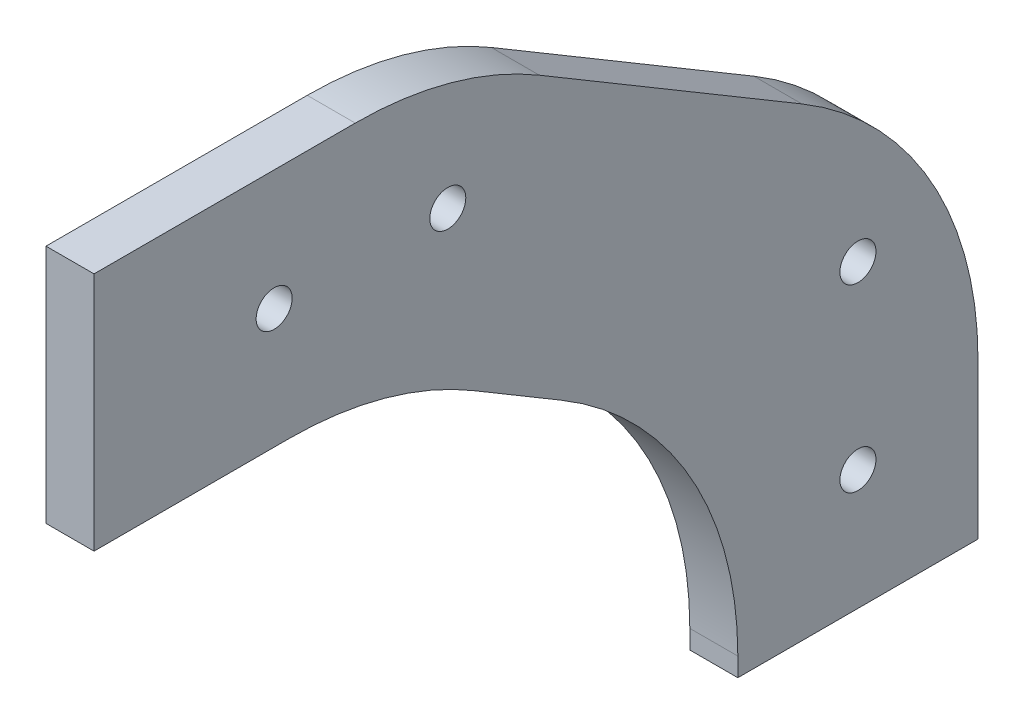
ISO-10303-21;
HEADER;
FILE_DESCRIPTION(('STEP AP214'),'2;1');
FILE_NAME('part.step','',(''),(''),'','','');
FILE_SCHEMA(('AUTOMOTIVE_DESIGN { 1 0 10303 214 1 1 1 1 }'));
ENDSEC;
DATA;
#1=APPLICATION_CONTEXT('core data for automotive mechanical design processes');
#2=APPLICATION_PROTOCOL_DEFINITION('international standard','automotive_design',2000,#1);
#3=PRODUCT_CONTEXT('',#1,'mechanical');
#4=PRODUCT('Part','Part','',(#3));
#5=PRODUCT_RELATED_PRODUCT_CATEGORY('part','',(#4));
#6=PRODUCT_DEFINITION_FORMATION('','',#4);
#7=PRODUCT_DEFINITION_CONTEXT('part definition',#1,'design');
#8=PRODUCT_DEFINITION('design','',#6,#7);
#9=PRODUCT_DEFINITION_SHAPE('','',#8);
#10=(LENGTH_UNIT() NAMED_UNIT(*) SI_UNIT(.MILLI.,.METRE.));
#11=(NAMED_UNIT(*) PLANE_ANGLE_UNIT() SI_UNIT($,.RADIAN.));
#12=(NAMED_UNIT(*) SI_UNIT($,.STERADIAN.) SOLID_ANGLE_UNIT());
#13=UNCERTAINTY_MEASURE_WITH_UNIT(LENGTH_MEASURE(1.E-05),#10,'distance_accuracy_value','');
#14=(GEOMETRIC_REPRESENTATION_CONTEXT(3) GLOBAL_UNCERTAINTY_ASSIGNED_CONTEXT((#13)) GLOBAL_UNIT_ASSIGNED_CONTEXT((#10,
#11,#12)) REPRESENTATION_CONTEXT('',''));
#15=CARTESIAN_POINT('',(0.,0.,0.));
#16=DIRECTION('',(0.,0.,1.));
#17=DIRECTION('',(1.,0.,0.));
#18=AXIS2_PLACEMENT_3D('',#15,#16,#17);
#19=CARTESIAN_POINT('',(4.,-27.3140015579769,-99.1176324259948));
#20=DIRECTION('',(0.,0.,-1.));
#21=DIRECTION('',(-1.,0.,0.));
#22=AXIS2_PLACEMENT_3D('',#19,#20,#21);
#23=PLANE('',#22);
#24=DIRECTION('',(0.,-1.,0.));
#25=VECTOR('',#24,1.);
#26=CARTESIAN_POINT('',(4.,-27.3140015579769,-99.1176324259948));
#27=LINE('',#26,#25);
#28=CARTESIAN_POINT('',(4.,-44.3776366971459,-99.1176324259948));
#29=VERTEX_POINT('',#28);
#30=CARTESIAN_POINT('',(4.,-45.938244798531,-99.1176324259948));
#31=VERTEX_POINT('',#30);
#32=EDGE_CURVE('E126',#29,#31,#27,.T.);
#33=ORIENTED_EDGE('',*,*,#32,.F.);
#34=DIRECTION('',(-1.,0.,0.));
#35=VECTOR('',#34,1.);
#36=CARTESIAN_POINT('',(0.,-44.3776366971459,-99.1176324259948));
#37=LINE('',#36,#35);
#38=CARTESIAN_POINT('',(0.,-44.3776366971459,-99.1176324259948));
#39=VERTEX_POINT('',#38);
#40=EDGE_CURVE('E153',#29,#39,#37,.T.);
#41=ORIENTED_EDGE('',*,*,#40,.T.);
#42=DIRECTION('',(0.,-1.,0.));
#43=VECTOR('',#42,1.);
#44=CARTESIAN_POINT('',(0.,-27.3140015579769,-99.1176324259948));
#45=LINE('',#44,#43);
#46=CARTESIAN_POINT('',(0.,-45.938244798531,-99.1176324259948));
#47=VERTEX_POINT('',#46);
#48=EDGE_CURVE('E151',#39,#47,#45,.T.);
#49=ORIENTED_EDGE('',*,*,#48,.T.);
#50=DIRECTION('',(-1.,0.,0.));
#51=VECTOR('',#50,1.);
#52=CARTESIAN_POINT('',(4.,-45.938244798531,-99.1176324259948));
#53=LINE('',#52,#51);
#54=EDGE_CURVE('E144',#31,#47,#53,.T.);
#55=ORIENTED_EDGE('',*,*,#54,.F.);
#56=EDGE_LOOP('',(#33,#41,#49,#55));
#57=FACE_BOUND('',#56,.T.);
#58=ADVANCED_FACE('F35',(#57),#23,.F.);
#59=CARTESIAN_POINT('',(4.,-45.938244798531,-119.117632425995));
#60=DIRECTION('',(0.,1.,0.));
#61=DIRECTION('',(0.,0.,1.));
#62=AXIS2_PLACEMENT_3D('',#59,#60,#61);
#63=PLANE('',#62);
#64=DIRECTION('',(0.,0.,-1.));
#65=VECTOR('',#64,1.);
#66=CARTESIAN_POINT('',(0.,-45.938244798531,-119.117632425995));
#67=LINE('',#66,#65);
#68=CARTESIAN_POINT('',(0.,-45.938244798531,-119.117632425995));
#69=VERTEX_POINT('',#68);
#70=EDGE_CURVE('E224',#47,#69,#67,.T.);
#71=ORIENTED_EDGE('',*,*,#70,.T.);
#72=DIRECTION('',(-1.,0.,0.));
#73=VECTOR('',#72,1.);
#74=CARTESIAN_POINT('',(4.,-45.938244798531,-119.117632425995));
#75=LINE('',#74,#73);
#76=CARTESIAN_POINT('',(4.,-45.938244798531,-119.117632425995));
#77=VERTEX_POINT('',#76);
#78=EDGE_CURVE('E146',#77,#69,#75,.T.);
#79=ORIENTED_EDGE('',*,*,#78,.F.);
#80=DIRECTION('',(0.,0.,-1.));
#81=VECTOR('',#80,1.);
#82=CARTESIAN_POINT('',(4.,-45.938244798531,-119.117632425995));
#83=LINE('',#82,#81);
#84=EDGE_CURVE('E130',#31,#77,#83,.T.);
#85=ORIENTED_EDGE('',*,*,#84,.F.);
#86=ORIENTED_EDGE('',*,*,#54,.T.);
#87=EDGE_LOOP('',(#71,#79,#85,#86));
#88=FACE_BOUND('',#87,.T.);
#89=ADVANCED_FACE('F143',(#88),#63,.F.);
#90=CARTESIAN_POINT('',(4.,-15.938244798531,-119.117632425995));
#91=DIRECTION('',(0.,0.,1.));
#92=DIRECTION('',(0.,-1.,0.));
#93=AXIS2_PLACEMENT_3D('',#90,#91,#92);
#94=PLANE('',#93);
#95=DIRECTION('',(0.,1.,0.));
#96=VECTOR('',#95,1.);
#97=CARTESIAN_POINT('',(0.,-15.938244798531,-119.117632425995));
#98=LINE('',#97,#96);
#99=CARTESIAN_POINT('',(0.,-33.0018799376999,-119.117632425995));
#100=VERTEX_POINT('',#99);
#101=EDGE_CURVE('E226',#69,#100,#98,.T.);
#102=ORIENTED_EDGE('',*,*,#101,.T.);
#103=DIRECTION('',(-1.,0.,0.));
#104=VECTOR('',#103,1.);
#105=CARTESIAN_POINT('',(4.,-33.0018799376999,-119.117632425995));
#106=LINE('',#105,#104);
#107=CARTESIAN_POINT('',(4.,-33.0018799376999,-119.117632425995));
#108=VERTEX_POINT('',#107);
#109=EDGE_CURVE('E174',#100,#108,#106,.F.);
#110=ORIENTED_EDGE('',*,*,#109,.T.);
#111=DIRECTION('',(0.,1.,0.));
#112=VECTOR('',#111,1.);
#113=CARTESIAN_POINT('',(4.,-15.938244798531,-119.117632425995));
#114=LINE('',#113,#112);
#115=EDGE_CURVE('E148',#77,#108,#114,.T.);
#116=ORIENTED_EDGE('',*,*,#115,.F.);
#117=ORIENTED_EDGE('',*,*,#78,.T.);
#118=EDGE_LOOP('',(#102,#110,#116,#117));
#119=FACE_BOUND('',#118,.T.);
#120=ADVANCED_FACE('F268',(#119),#94,.F.);
#121=CARTESIAN_POINT('',(4.,9.99999999999998,-75.499640594676));
#122=DIRECTION('',(0.,-0.85950799064041,0.511122308283726));
#123=DIRECTION('',(0.,-0.511122308283726,-0.85950799064041));
#124=AXIS2_PLACEMENT_3D('',#121,#122,#123);
#125=PLANE('',#124);
#126=DIRECTION('',(0.,0.511122308283726,0.85950799064041));
#127=VECTOR('',#126,1.);
#128=CARTESIAN_POINT('',(4.,9.99999999999998,-75.499640594676));
#129=LINE('',#128,#127);
#130=CARTESIAN_POINT('',(4.,-7.21664021848762,-104.451301674507));
#131=VERTEX_POINT('',#130);
#132=CARTESIAN_POINT('',(4.,5.78523971921229,-82.587220379904));
#133=VERTEX_POINT('',#132);
#134=EDGE_CURVE('E212',#131,#133,#129,.T.);
#135=ORIENTED_EDGE('',*,*,#134,.F.);
#136=DIRECTION('',(-1.,0.,0.));
#137=VECTOR('',#136,1.);
#138=CARTESIAN_POINT('',(4.,-7.21664021848762,-104.451301674507));
#139=LINE('',#138,#137);
#140=CARTESIAN_POINT('',(0.,-7.21664021848762,-104.451301674507));
#141=VERTEX_POINT('',#140);
#142=EDGE_CURVE('E167',#131,#141,#139,.T.);
#143=ORIENTED_EDGE('',*,*,#142,.T.);
#144=DIRECTION('',(0.,0.511122308283726,0.85950799064041));
#145=VECTOR('',#144,1.);
#146=CARTESIAN_POINT('',(0.,9.99999999999998,-75.499640594676));
#147=LINE('',#146,#145);
#148=CARTESIAN_POINT('',(0.,5.78523971921229,-82.587220379904));
#149=VERTEX_POINT('',#148);
#150=EDGE_CURVE('E229',#141,#149,#147,.T.);
#151=ORIENTED_EDGE('',*,*,#150,.T.);
#152=DIRECTION('',(-1.,0.,0.));
#153=VECTOR('',#152,1.);
#154=CARTESIAN_POINT('',(4.,5.78523971921229,-82.587220379904));
#155=LINE('',#154,#153);
#156=EDGE_CURVE('E165',#149,#133,#155,.F.);
#157=ORIENTED_EDGE('',*,*,#156,.T.);
#158=EDGE_LOOP('',(#135,#143,#151,#157));
#159=FACE_BOUND('',#158,.T.);
#160=ADVANCED_FACE('F276',(#159),#125,.F.);
#161=CARTESIAN_POINT('',(4.,9.99999999999998,-45.499640594676));
#162=DIRECTION('',(0.,-1.,0.));
#163=DIRECTION('',(0.,0.,-1.));
#164=AXIS2_PLACEMENT_3D('',#161,#162,#163);
#165=PLANE('',#164);
#166=DIRECTION('',(0.,0.,1.));
#167=VECTOR('',#166,1.);
#168=CARTESIAN_POINT('',(4.,9.99999999999998,-45.499640594676));
#169=LINE('',#168,#167);
#170=CARTESIAN_POINT('',(4.,9.99999999999998,-67.2535511313922));
#171=VERTEX_POINT('',#170);
#172=CARTESIAN_POINT('',(4.,9.99999999999998,-45.499640594676));
#173=VERTEX_POINT('',#172);
#174=EDGE_CURVE('E214',#171,#173,#169,.T.);
#175=ORIENTED_EDGE('',*,*,#174,.F.);
#176=DIRECTION('',(-1.,0.,0.));
#177=VECTOR('',#176,1.);
#178=CARTESIAN_POINT('',(4.,9.99999999999998,-67.2535511313922));
#179=LINE('',#178,#177);
#180=CARTESIAN_POINT('',(0.,9.99999999999998,-67.2535511313922));
#181=VERTEX_POINT('',#180);
#182=EDGE_CURVE('E180',#171,#181,#179,.T.);
#183=ORIENTED_EDGE('',*,*,#182,.T.);
#184=DIRECTION('',(0.,0.,1.));
#185=VECTOR('',#184,1.);
#186=CARTESIAN_POINT('',(0.,9.99999999999998,-45.499640594676));
#187=LINE('',#186,#185);
#188=CARTESIAN_POINT('',(0.,9.99999999999998,-45.499640594676));
#189=VERTEX_POINT('',#188);
#190=EDGE_CURVE('E232',#181,#189,#187,.T.);
#191=ORIENTED_EDGE('',*,*,#190,.T.);
#192=DIRECTION('',(-1.,0.,0.));
#193=VECTOR('',#192,1.);
#194=CARTESIAN_POINT('',(4.,9.99999999999998,-45.499640594676));
#195=LINE('',#194,#193);
#196=EDGE_CURVE('E157',#173,#189,#195,.T.);
#197=ORIENTED_EDGE('',*,*,#196,.F.);
#198=EDGE_LOOP('',(#175,#183,#191,#197));
#199=FACE_BOUND('',#198,.T.);
#200=ADVANCED_FACE('F280',(#199),#165,.F.);
#201=CARTESIAN_POINT('',(4.,-9.99999999999999,-45.499640594676));
#202=DIRECTION('',(0.,0.,-1.));
#203=DIRECTION('',(-1.,0.,0.));
#204=AXIS2_PLACEMENT_3D('',#201,#202,#203);
#205=PLANE('',#204);
#206=DIRECTION('',(0.,-1.,0.));
#207=VECTOR('',#206,1.);
#208=CARTESIAN_POINT('',(0.,-9.99999999999999,-45.499640594676));
#209=LINE('',#208,#207);
#210=CARTESIAN_POINT('',(0.,-9.99999999999999,-45.499640594676));
#211=VERTEX_POINT('',#210);
#212=EDGE_CURVE('E234',#189,#211,#209,.T.);
#213=ORIENTED_EDGE('',*,*,#212,.T.);
#214=DIRECTION('',(-1.,0.,0.));
#215=VECTOR('',#214,1.);
#216=CARTESIAN_POINT('',(4.,-9.99999999999999,-45.499640594676));
#217=LINE('',#216,#215);
#218=CARTESIAN_POINT('',(4.,-9.99999999999999,-45.499640594676));
#219=VERTEX_POINT('',#218);
#220=EDGE_CURVE('E222',#219,#211,#217,.T.);
#221=ORIENTED_EDGE('',*,*,#220,.F.);
#222=DIRECTION('',(0.,-1.,0.));
#223=VECTOR('',#222,1.);
#224=CARTESIAN_POINT('',(4.,-9.99999999999999,-45.499640594676));
#225=LINE('',#224,#223);
#226=EDGE_CURVE('E216',#173,#219,#225,.T.);
#227=ORIENTED_EDGE('',*,*,#226,.F.);
#228=ORIENTED_EDGE('',*,*,#196,.T.);
#229=EDGE_LOOP('',(#213,#221,#227,#228));
#230=FACE_BOUND('',#229,.T.);
#231=ADVANCED_FACE('F246',(#230),#205,.F.);
#232=CARTESIAN_POINT('',(4.,-9.99999999999999,-70.0022476191534));
#233=DIRECTION('',(0.,1.,0.));
#234=DIRECTION('',(0.,0.,1.));
#235=AXIS2_PLACEMENT_3D('',#232,#233,#234);
#236=PLANE('',#235);
#237=DIRECTION('',(0.,0.,-1.));
#238=VECTOR('',#237,1.);
#239=CARTESIAN_POINT('',(0.,-9.99999999999999,-70.0022476191534));
#240=LINE('',#239,#238);
#241=CARTESIAN_POINT('',(0.,-9.99999999999999,-61.7561581558697));
#242=VERTEX_POINT('',#241);
#243=EDGE_CURVE('E236',#211,#242,#240,.T.);
#244=ORIENTED_EDGE('',*,*,#243,.T.);
#245=DIRECTION('',(-1.,0.,0.));
#246=VECTOR('',#245,1.);
#247=CARTESIAN_POINT('',(4.,-9.99999999999999,-61.7561581558697));
#248=LINE('',#247,#246);
#249=CARTESIAN_POINT('',(4.,-9.99999999999999,-61.7561581558697));
#250=VERTEX_POINT('',#249);
#251=EDGE_CURVE('E52',#242,#250,#248,.F.);
#252=ORIENTED_EDGE('',*,*,#251,.T.);
#253=DIRECTION('',(0.,0.,-1.));
#254=VECTOR('',#253,1.);
#255=CARTESIAN_POINT('',(4.,-9.99999999999999,-70.0022476191534));
#256=LINE('',#255,#254);
#257=EDGE_CURVE('E218',#219,#250,#256,.T.);
#258=ORIENTED_EDGE('',*,*,#257,.F.);
#259=ORIENTED_EDGE('',*,*,#220,.T.);
#260=EDGE_LOOP('',(#244,#252,#258,#259));
#261=FACE_BOUND('',#260,.T.);
#262=ADVANCED_FACE('F255',(#261),#236,.F.);
#263=CARTESIAN_POINT('',(4.,-9.99999999999999,-70.0022476191534));
#264=DIRECTION('',(0.,0.85950799064041,-0.511122308283726));
#265=DIRECTION('',(0.,0.511122308283726,0.85950799064041));
#266=AXIS2_PLACEMENT_3D('',#263,#264,#265);
#267=PLANE('',#266);
#268=DIRECTION('',(0.,-0.511122308283726,-0.85950799064041));
#269=VECTOR('',#268,1.);
#270=CARTESIAN_POINT('',(0.,-9.99999999999999,-70.0022476191534));
#271=LINE('',#270,#269);
#272=CARTESIAN_POINT('',(0.,-14.2147602807877,-77.0898274043815));
#273=VERTEX_POINT('',#272);
#274=CARTESIAN_POINT('',(0.,-18.5923969779336,-84.4513016745066));
#275=VERTEX_POINT('',#274);
#276=EDGE_CURVE('E139',#273,#275,#271,.T.);
#277=ORIENTED_EDGE('',*,*,#276,.T.);
#278=DIRECTION('',(-1.,0.,0.));
#279=VECTOR('',#278,1.);
#280=CARTESIAN_POINT('',(4.,-18.5923969779336,-84.4513016745066));
#281=LINE('',#280,#279);
#282=CARTESIAN_POINT('',(4.,-18.5923969779336,-84.4513016745066));
#283=VERTEX_POINT('',#282);
#284=EDGE_CURVE('E163',#275,#283,#281,.F.);
#285=ORIENTED_EDGE('',*,*,#284,.T.);
#286=DIRECTION('',(0.,-0.511122308283726,-0.85950799064041));
#287=VECTOR('',#286,1.);
#288=CARTESIAN_POINT('',(4.,-9.99999999999999,-70.0022476191534));
#289=LINE('',#288,#287);
#290=CARTESIAN_POINT('',(4.,-14.2147602807877,-77.0898274043815));
#291=VERTEX_POINT('',#290);
#292=EDGE_CURVE('E220',#291,#283,#289,.T.);
#293=ORIENTED_EDGE('',*,*,#292,.F.);
#294=DIRECTION('',(-1.,0.,0.));
#295=VECTOR('',#294,1.);
#296=CARTESIAN_POINT('',(0.,-14.2147602807877,-77.0898274043815));
#297=LINE('',#296,#295);
#298=EDGE_CURVE('E155',#291,#273,#297,.T.);
#299=ORIENTED_EDGE('',*,*,#298,.T.);
#300=EDGE_LOOP('',(#277,#285,#293,#299));
#301=FACE_BOUND('',#300,.T.);
#302=ADVANCED_FACE('F262',(#301),#267,.F.);
#303=CARTESIAN_POINT('',(4.,0.,0.));
#304=DIRECTION('',(-1.,0.,0.));
#305=DIRECTION('',(0.,0.,1.));
#306=AXIS2_PLACEMENT_3D('',#303,#304,#305);
#307=PLANE('',#306);
#308=CARTESIAN_POINT('',(4.,-20.938244798531,-109.117632425995));
#309=DIRECTION('',(1.,0.,0.));
#310=DIRECTION('',(0.,0.,-1.));
#311=AXIS2_PLACEMENT_3D('',#308,#309,#310);
#312=CIRCLE('',#311,1.5);
#313=CARTESIAN_POINT('',(4.,-20.938244798531,-110.617632425995));
#314=VERTEX_POINT('',#313);
#315=EDGE_CURVE('E206',#314,#314,#312,.T.);
#316=ORIENTED_EDGE('',*,*,#315,.F.);
#317=EDGE_LOOP('',(#316));
#318=FACE_BOUND('',#317,.T.);
#319=CARTESIAN_POINT('',(4.,-35.938244798531,-109.117632425995));
#320=DIRECTION('',(1.,0.,0.));
#321=DIRECTION('',(0.,0.,-1.));
#322=AXIS2_PLACEMENT_3D('',#319,#320,#321);
#323=CIRCLE('',#322,1.5);
#324=CARTESIAN_POINT('',(4.,-35.938244798531,-110.617632425995));
#325=VERTEX_POINT('',#324);
#326=EDGE_CURVE('E196',#325,#325,#323,.T.);
#327=ORIENTED_EDGE('',*,*,#326,.F.);
#328=EDGE_LOOP('',(#327));
#329=FACE_BOUND('',#328,.T.);
#330=CARTESIAN_POINT('',(4.,2.16840434497101E-13,-74.9599612957073));
#331=DIRECTION('',(1.,0.,0.));
#332=DIRECTION('',(0.,0.,-1.));
#333=AXIS2_PLACEMENT_3D('',#330,#331,#332);
#334=CIRCLE('',#333,1.5);
#335=CARTESIAN_POINT('',(4.,2.16840434497101E-13,-76.4599612957073));
#336=VERTEX_POINT('',#335);
#337=EDGE_CURVE('E193',#336,#336,#334,.T.);
#338=ORIENTED_EDGE('',*,*,#337,.F.);
#339=EDGE_LOOP('',(#338));
#340=FACE_BOUND('',#339,.T.);
#341=CARTESIAN_POINT('',(4.,1.89084858881472E-13,-60.499640594676));
#342=DIRECTION('',(1.,0.,0.));
#343=DIRECTION('',(0.,0.,-1.));
#344=AXIS2_PLACEMENT_3D('',#341,#342,#343);
#345=CIRCLE('',#344,1.5);
#346=CARTESIAN_POINT('',(4.,1.89084858881472E-13,-61.999640594676));
#347=VERTEX_POINT('',#346);
#348=EDGE_CURVE('E190',#347,#347,#345,.T.);
#349=ORIENTED_EDGE('',*,*,#348,.F.);
#350=EDGE_LOOP('',(#349));
#351=FACE_BOUND('',#350,.T.);
#352=ORIENTED_EDGE('',*,*,#115,.T.);
#353=CARTESIAN_POINT('',(4.,-33.0018799376999,-89.1176324259948));
#354=DIRECTION('',(-1.,0.,0.));
#355=DIRECTION('',(0.,0.,1.));
#356=AXIS2_PLACEMENT_3D('',#353,#354,#355);
#357=CIRCLE('',#356,30.);
#358=EDGE_CURVE('E177',#108,#131,#357,.F.);
#359=ORIENTED_EDGE('',*,*,#358,.T.);
#360=ORIENTED_EDGE('',*,*,#134,.T.);
#361=CARTESIAN_POINT('',(4.,-20.,-67.2535511313922));
#362=DIRECTION('',(-1.,0.,0.));
#363=DIRECTION('',(0.,0.,1.));
#364=AXIS2_PLACEMENT_3D('',#361,#362,#363);
#365=CIRCLE('',#364,30.);
#366=EDGE_CURVE('E60',#133,#171,#365,.F.);
#367=ORIENTED_EDGE('',*,*,#366,.T.);
#368=ORIENTED_EDGE('',*,*,#174,.T.);
#369=ORIENTED_EDGE('',*,*,#226,.T.);
#370=ORIENTED_EDGE('',*,*,#257,.T.);
#371=CARTESIAN_POINT('',(4.,-40.,-61.7561581558697));
#372=DIRECTION('',(-1.,0.,0.));
#373=DIRECTION('',(0.,0.,1.));
#374=AXIS2_PLACEMENT_3D('',#371,#372,#373);
#375=CIRCLE('',#374,30.);
#376=EDGE_CURVE('E11',#250,#291,#375,.T.);
#377=ORIENTED_EDGE('',*,*,#376,.T.);
#378=ORIENTED_EDGE('',*,*,#292,.T.);
#379=CARTESIAN_POINT('',(4.,-44.3776366971459,-69.1176324259948));
#380=DIRECTION('',(-1.,0.,0.));
#381=DIRECTION('',(0.,0.,1.));
#382=AXIS2_PLACEMENT_3D('',#379,#380,#381);
#383=CIRCLE('',#382,30.);
#384=EDGE_CURVE('E134',#283,#29,#383,.T.);
#385=ORIENTED_EDGE('',*,*,#384,.T.);
#386=ORIENTED_EDGE('',*,*,#32,.T.);
#387=ORIENTED_EDGE('',*,*,#84,.T.);
#388=EDGE_LOOP('',(#352,#359,#360,#367,#368,#369,#370,#377,#378,#385,#386,#387));
#389=FACE_BOUND('',#388,.T.);
#390=ADVANCED_FACE('F129',(#318,#329,#340,#351,#389),#307,.F.);
#391=CARTESIAN_POINT('',(0.,0.,0.));
#392=DIRECTION('',(-1.,0.,0.));
#393=DIRECTION('',(0.,0.,1.));
#394=AXIS2_PLACEMENT_3D('',#391,#392,#393);
#395=PLANE('',#394);
#396=CARTESIAN_POINT('',(0.,-20.938244798531,-109.117632425995));
#397=DIRECTION('',(-1.,0.,0.));
#398=DIRECTION('',(0.,0.,1.));
#399=AXIS2_PLACEMENT_3D('',#396,#397,#398);
#400=CIRCLE('',#399,1.5);
#401=CARTESIAN_POINT('',(0.,-20.938244798531,-107.617632425995));
#402=VERTEX_POINT('',#401);
#403=EDGE_CURVE('E39',#402,#402,#400,.T.);
#404=ORIENTED_EDGE('',*,*,#403,.F.);
#405=EDGE_LOOP('',(#404));
#406=FACE_BOUND('',#405,.T.);
#407=CARTESIAN_POINT('',(0.,-35.938244798531,-109.117632425995));
#408=DIRECTION('',(-1.,0.,0.));
#409=DIRECTION('',(0.,0.,1.));
#410=AXIS2_PLACEMENT_3D('',#407,#408,#409);
#411=CIRCLE('',#410,1.5);
#412=CARTESIAN_POINT('',(0.,-35.938244798531,-107.617632425995));
#413=VERTEX_POINT('',#412);
#414=EDGE_CURVE('E194',#413,#413,#411,.T.);
#415=ORIENTED_EDGE('',*,*,#414,.F.);
#416=EDGE_LOOP('',(#415));
#417=FACE_BOUND('',#416,.T.);
#418=CARTESIAN_POINT('',(0.,2.16840434497101E-13,-74.9599612957073));
#419=DIRECTION('',(-1.,0.,0.));
#420=DIRECTION('',(0.,0.,1.));
#421=AXIS2_PLACEMENT_3D('',#418,#419,#420);
#422=CIRCLE('',#421,1.5);
#423=CARTESIAN_POINT('',(0.,2.16840434497101E-13,-73.4599612957073));
#424=VERTEX_POINT('',#423);
#425=EDGE_CURVE('E191',#424,#424,#422,.T.);
#426=ORIENTED_EDGE('',*,*,#425,.F.);
#427=EDGE_LOOP('',(#426));
#428=FACE_BOUND('',#427,.T.);
#429=CARTESIAN_POINT('',(0.,1.89084858881472E-13,-60.499640594676));
#430=DIRECTION('',(-1.,0.,0.));
#431=DIRECTION('',(0.,0.,1.));
#432=AXIS2_PLACEMENT_3D('',#429,#430,#431);
#433=CIRCLE('',#432,1.5);
#434=CARTESIAN_POINT('',(0.,1.89084858881472E-13,-58.999640594676));
#435=VERTEX_POINT('',#434);
#436=EDGE_CURVE('E187',#435,#435,#433,.T.);
#437=ORIENTED_EDGE('',*,*,#436,.F.);
#438=EDGE_LOOP('',(#437));
#439=FACE_BOUND('',#438,.T.);
#440=ORIENTED_EDGE('',*,*,#150,.F.);
#441=CARTESIAN_POINT('',(0.,-33.0018799376999,-89.1176324259948));
#442=DIRECTION('',(-1.,0.,0.));
#443=DIRECTION('',(0.,0.,1.));
#444=AXIS2_PLACEMENT_3D('',#441,#442,#443);
#445=CIRCLE('',#444,30.);
#446=EDGE_CURVE('E172',#141,#100,#445,.T.);
#447=ORIENTED_EDGE('',*,*,#446,.T.);
#448=ORIENTED_EDGE('',*,*,#101,.F.);
#449=ORIENTED_EDGE('',*,*,#70,.F.);
#450=ORIENTED_EDGE('',*,*,#48,.F.);
#451=CARTESIAN_POINT('',(0.,-44.3776366971459,-69.1176324259948));
#452=DIRECTION('',(-1.,0.,0.));
#453=DIRECTION('',(0.,0.,1.));
#454=AXIS2_PLACEMENT_3D('',#451,#452,#453);
#455=CIRCLE('',#454,30.);
#456=EDGE_CURVE('E183',#39,#275,#455,.F.);
#457=ORIENTED_EDGE('',*,*,#456,.T.);
#458=ORIENTED_EDGE('',*,*,#276,.F.);
#459=CARTESIAN_POINT('',(0.,-40.,-61.7561581558697));
#460=DIRECTION('',(-1.,0.,0.));
#461=DIRECTION('',(0.,0.,1.));
#462=AXIS2_PLACEMENT_3D('',#459,#460,#461);
#463=CIRCLE('',#462,30.);
#464=EDGE_CURVE('E44',#273,#242,#463,.F.);
#465=ORIENTED_EDGE('',*,*,#464,.T.);
#466=ORIENTED_EDGE('',*,*,#243,.F.);
#467=ORIENTED_EDGE('',*,*,#212,.F.);
#468=ORIENTED_EDGE('',*,*,#190,.F.);
#469=CARTESIAN_POINT('',(0.,-20.,-67.2535511313922));
#470=DIRECTION('',(-1.,0.,0.));
#471=DIRECTION('',(0.,0.,1.));
#472=AXIS2_PLACEMENT_3D('',#469,#470,#471);
#473=CIRCLE('',#472,30.);
#474=EDGE_CURVE('E170',#181,#149,#473,.T.);
#475=ORIENTED_EDGE('',*,*,#474,.T.);
#476=EDGE_LOOP('',(#440,#447,#448,#449,#450,#457,#458,#465,#466,#467,#468,#475));
#477=FACE_BOUND('',#476,.T.);
#478=ADVANCED_FACE('F253',(#406,#417,#428,#439,#477),#395,.T.);
#479=CARTESIAN_POINT('',(4.,-44.3776366971459,-69.1176324259948));
#480=DIRECTION('',(1.,0.,0.));
#481=DIRECTION('',(0.,0.,-1.));
#482=AXIS2_PLACEMENT_3D('',#479,#480,#481);
#483=CYLINDRICAL_SURFACE('',#482,30.);
#484=ORIENTED_EDGE('',*,*,#384,.F.);
#485=ORIENTED_EDGE('',*,*,#284,.F.);
#486=ORIENTED_EDGE('',*,*,#456,.F.);
#487=ORIENTED_EDGE('',*,*,#40,.F.);
#488=EDGE_LOOP('',(#484,#485,#486,#487));
#489=FACE_BOUND('',#488,.T.);
#490=ADVANCED_FACE('F265',(#489),#483,.F.);
#491=CARTESIAN_POINT('',(4.,-33.0018799376999,-89.1176324259948));
#492=DIRECTION('',(-1.,0.,0.));
#493=DIRECTION('',(0.,0.,1.));
#494=AXIS2_PLACEMENT_3D('',#491,#492,#493);
#495=CYLINDRICAL_SURFACE('',#494,30.);
#496=ORIENTED_EDGE('',*,*,#358,.F.);
#497=ORIENTED_EDGE('',*,*,#109,.F.);
#498=ORIENTED_EDGE('',*,*,#446,.F.);
#499=ORIENTED_EDGE('',*,*,#142,.F.);
#500=EDGE_LOOP('',(#496,#497,#498,#499));
#501=FACE_BOUND('',#500,.T.);
#502=ADVANCED_FACE('F274',(#501),#495,.T.);
#503=CARTESIAN_POINT('',(4.,-40.,-61.7561581558697));
#504=DIRECTION('',(1.,0.,0.));
#505=DIRECTION('',(0.,0.,-1.));
#506=AXIS2_PLACEMENT_3D('',#503,#504,#505);
#507=CYLINDRICAL_SURFACE('',#506,30.);
#508=ORIENTED_EDGE('',*,*,#376,.F.);
#509=ORIENTED_EDGE('',*,*,#251,.F.);
#510=ORIENTED_EDGE('',*,*,#464,.F.);
#511=ORIENTED_EDGE('',*,*,#298,.F.);
#512=EDGE_LOOP('',(#508,#509,#510,#511));
#513=FACE_BOUND('',#512,.T.);
#514=ADVANCED_FACE('F258',(#513),#507,.F.);
#515=CARTESIAN_POINT('',(4.,-20.,-67.2535511313922));
#516=DIRECTION('',(-1.,0.,0.));
#517=DIRECTION('',(0.,0.,1.));
#518=AXIS2_PLACEMENT_3D('',#515,#516,#517);
#519=CYLINDRICAL_SURFACE('',#518,30.);
#520=ORIENTED_EDGE('',*,*,#366,.F.);
#521=ORIENTED_EDGE('',*,*,#156,.F.);
#522=ORIENTED_EDGE('',*,*,#474,.F.);
#523=ORIENTED_EDGE('',*,*,#182,.F.);
#524=EDGE_LOOP('',(#520,#521,#522,#523));
#525=FACE_BOUND('',#524,.T.);
#526=ADVANCED_FACE('F37',(#525),#519,.T.);
#527=CARTESIAN_POINT('',(-46.,1.89084858881472E-13,-60.499640594676));
#528=DIRECTION('',(1.,0.,0.));
#529=DIRECTION('',(0.,0.,-1.));
#530=AXIS2_PLACEMENT_3D('',#527,#528,#529);
#531=CYLINDRICAL_SURFACE('',#530,1.5);
#532=ORIENTED_EDGE('',*,*,#436,.T.);
#533=EDGE_LOOP('',(#532));
#534=FACE_BOUND('',#533,.T.);
#535=ORIENTED_EDGE('',*,*,#348,.T.);
#536=EDGE_LOOP('',(#535));
#537=FACE_BOUND('',#536,.T.);
#538=ADVANCED_FACE('F304',(#534,#537),#531,.F.);
#539=CARTESIAN_POINT('',(-46.,2.16840434497101E-13,-74.9599612957073));
#540=DIRECTION('',(1.,0.,0.));
#541=DIRECTION('',(0.,0.,-1.));
#542=AXIS2_PLACEMENT_3D('',#539,#540,#541);
#543=CYLINDRICAL_SURFACE('',#542,1.5);
#544=ORIENTED_EDGE('',*,*,#425,.T.);
#545=EDGE_LOOP('',(#544));
#546=FACE_BOUND('',#545,.T.);
#547=ORIENTED_EDGE('',*,*,#337,.T.);
#548=EDGE_LOOP('',(#547));
#549=FACE_BOUND('',#548,.T.);
#550=ADVANCED_FACE('F308',(#546,#549),#543,.F.);
#551=CARTESIAN_POINT('',(-6.,-35.938244798531,-109.117632425995));
#552=DIRECTION('',(1.,0.,0.));
#553=DIRECTION('',(0.,0.,-1.));
#554=AXIS2_PLACEMENT_3D('',#551,#552,#553);
#555=CYLINDRICAL_SURFACE('',#554,1.5);
#556=ORIENTED_EDGE('',*,*,#414,.T.);
#557=EDGE_LOOP('',(#556));
#558=FACE_BOUND('',#557,.T.);
#559=ORIENTED_EDGE('',*,*,#326,.T.);
#560=EDGE_LOOP('',(#559));
#561=FACE_BOUND('',#560,.T.);
#562=ADVANCED_FACE('F314',(#558,#561),#555,.F.);
#563=CARTESIAN_POINT('',(-6.,-20.938244798531,-109.117632425995));
#564=DIRECTION('',(1.,0.,0.));
#565=DIRECTION('',(0.,0.,-1.));
#566=AXIS2_PLACEMENT_3D('',#563,#564,#565);
#567=CYLINDRICAL_SURFACE('',#566,1.5);
#568=ORIENTED_EDGE('',*,*,#403,.T.);
#569=EDGE_LOOP('',(#568));
#570=FACE_BOUND('',#569,.T.);
#571=ORIENTED_EDGE('',*,*,#315,.T.);
#572=EDGE_LOOP('',(#571));
#573=FACE_BOUND('',#572,.T.);
#574=ADVANCED_FACE('F380',(#570,#573),#567,.F.);
#575=CLOSED_SHELL('',(#58,#89,#120,#160,#200,#231,#262,#302,#390,#478,#490,#502,#514,#526,#538,
#550,#562,#574));
#576=MANIFOLD_SOLID_BREP('B2',#575);
#577=ADVANCED_BREP_SHAPE_REPRESENTATION('',(#18,#576),#14);
#578=SHAPE_DEFINITION_REPRESENTATION(#9,#577);
ENDSEC;
END-ISO-10303-21;
